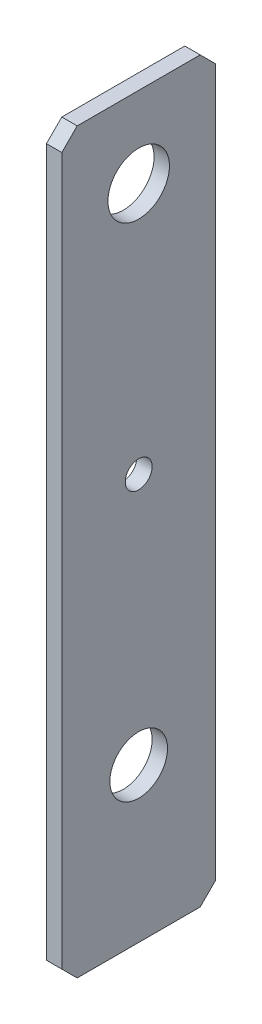
ISO-10303-21;
HEADER;
FILE_DESCRIPTION(('STEP AP214'),'2;1');
FILE_NAME('part.step','',(''),(''),'','','');
FILE_SCHEMA(('AUTOMOTIVE_DESIGN { 1 0 10303 214 1 1 1 1 }'));
ENDSEC;
DATA;
#1=APPLICATION_CONTEXT('core data for automotive mechanical design processes');
#2=APPLICATION_PROTOCOL_DEFINITION('international standard','automotive_design',2000,#1);
#3=PRODUCT_CONTEXT('',#1,'mechanical');
#4=PRODUCT('Part','Part','',(#3));
#5=PRODUCT_RELATED_PRODUCT_CATEGORY('part','',(#4));
#6=PRODUCT_DEFINITION_FORMATION('','',#4);
#7=PRODUCT_DEFINITION_CONTEXT('part definition',#1,'design');
#8=PRODUCT_DEFINITION('design','',#6,#7);
#9=PRODUCT_DEFINITION_SHAPE('','',#8);
#10=(LENGTH_UNIT() NAMED_UNIT(*) SI_UNIT(.MILLI.,.METRE.));
#11=(NAMED_UNIT(*) PLANE_ANGLE_UNIT() SI_UNIT($,.RADIAN.));
#12=(NAMED_UNIT(*) SI_UNIT($,.STERADIAN.) SOLID_ANGLE_UNIT());
#13=UNCERTAINTY_MEASURE_WITH_UNIT(LENGTH_MEASURE(1.E-05),#10,'distance_accuracy_value','');
#14=(GEOMETRIC_REPRESENTATION_CONTEXT(3) GLOBAL_UNCERTAINTY_ASSIGNED_CONTEXT((#13)) GLOBAL_UNIT_ASSIGNED_CONTEXT((#10,
#11,#12)) REPRESENTATION_CONTEXT('',''));
#15=CARTESIAN_POINT('',(0.,0.,0.));
#16=DIRECTION('',(0.,0.,1.));
#17=DIRECTION('',(1.,0.,0.));
#18=AXIS2_PLACEMENT_3D('',#15,#16,#17);
#19=CARTESIAN_POINT('',(2.,-48.,-10.));
#20=DIRECTION('',(0.,0.,1.));
#21=DIRECTION('',(1.,0.,0.));
#22=AXIS2_PLACEMENT_3D('',#19,#20,#21);
#23=PLANE('',#22);
#24=DIRECTION('',(0.,1.,0.));
#25=VECTOR('',#24,1.);
#26=CARTESIAN_POINT('',(2.,-48.,-10.));
#27=LINE('',#26,#25);
#28=CARTESIAN_POINT('',(2.,-46.,-10.));
#29=VERTEX_POINT('',#28);
#30=CARTESIAN_POINT('',(2.,46.,-10.));
#31=VERTEX_POINT('',#30);
#32=EDGE_CURVE('E134',#29,#31,#27,.T.);
#33=ORIENTED_EDGE('',*,*,#32,.F.);
#34=DIRECTION('',(-1.,0.,0.));
#35=VECTOR('',#34,1.);
#36=CARTESIAN_POINT('',(2.,-46.,-10.));
#37=LINE('',#36,#35);
#38=CARTESIAN_POINT('',(0.,-46.,-10.));
#39=VERTEX_POINT('',#38);
#40=EDGE_CURVE('E160',#29,#39,#37,.T.);
#41=ORIENTED_EDGE('',*,*,#40,.T.);
#42=DIRECTION('',(0.,1.,0.));
#43=VECTOR('',#42,1.);
#44=CARTESIAN_POINT('',(0.,-48.,-10.));
#45=LINE('',#44,#43);
#46=CARTESIAN_POINT('',(0.,46.,-10.));
#47=VERTEX_POINT('',#46);
#48=EDGE_CURVE('E166',#39,#47,#45,.T.);
#49=ORIENTED_EDGE('',*,*,#48,.T.);
#50=DIRECTION('',(1.,0.,0.));
#51=VECTOR('',#50,1.);
#52=CARTESIAN_POINT('',(2.,46.,-10.));
#53=LINE('',#52,#51);
#54=EDGE_CURVE('E158',#47,#31,#53,.T.);
#55=ORIENTED_EDGE('',*,*,#54,.T.);
#56=EDGE_LOOP('',(#33,#41,#49,#55));
#57=FACE_BOUND('',#56,.T.);
#58=ADVANCED_FACE('F41',(#57),#23,.F.);
#59=CARTESIAN_POINT('',(2.,48.,10.));
#60=DIRECTION('',(0.,-1.,0.));
#61=DIRECTION('',(0.,0.,-1.));
#62=AXIS2_PLACEMENT_3D('',#59,#60,#61);
#63=PLANE('',#62);
#64=DIRECTION('',(0.,0.,1.));
#65=VECTOR('',#64,1.);
#66=CARTESIAN_POINT('',(2.,48.,10.));
#67=LINE('',#66,#65);
#68=CARTESIAN_POINT('',(2.,48.,-8.));
#69=VERTEX_POINT('',#68);
#70=CARTESIAN_POINT('',(2.,48.,7.99999999999999));
#71=VERTEX_POINT('',#70);
#72=EDGE_CURVE('E137',#69,#71,#67,.T.);
#73=ORIENTED_EDGE('',*,*,#72,.F.);
#74=DIRECTION('',(-1.,0.,0.));
#75=VECTOR('',#74,1.);
#76=CARTESIAN_POINT('',(2.,48.,-8.));
#77=LINE('',#76,#75);
#78=CARTESIAN_POINT('',(0.,48.,-8.));
#79=VERTEX_POINT('',#78);
#80=EDGE_CURVE('E11',#69,#79,#77,.T.);
#81=ORIENTED_EDGE('',*,*,#80,.T.);
#82=DIRECTION('',(0.,0.,1.));
#83=VECTOR('',#82,1.);
#84=CARTESIAN_POINT('',(0.,48.,10.));
#85=LINE('',#84,#83);
#86=CARTESIAN_POINT('',(0.,48.,7.99999999999999));
#87=VERTEX_POINT('',#86);
#88=EDGE_CURVE('E139',#79,#87,#85,.T.);
#89=ORIENTED_EDGE('',*,*,#88,.T.);
#90=DIRECTION('',(1.,0.,0.));
#91=VECTOR('',#90,1.);
#92=CARTESIAN_POINT('',(2.,48.,7.99999999999999));
#93=LINE('',#92,#91);
#94=EDGE_CURVE('E50',#87,#71,#93,.T.);
#95=ORIENTED_EDGE('',*,*,#94,.T.);
#96=EDGE_LOOP('',(#73,#81,#89,#95));
#97=FACE_BOUND('',#96,.T.);
#98=ADVANCED_FACE('F211',(#97),#63,.F.);
#99=CARTESIAN_POINT('',(2.,-48.,10.));
#100=DIRECTION('',(0.,0.,-1.));
#101=DIRECTION('',(-1.,0.,0.));
#102=AXIS2_PLACEMENT_3D('',#99,#100,#101);
#103=PLANE('',#102);
#104=DIRECTION('',(0.,-1.,0.));
#105=VECTOR('',#104,1.);
#106=CARTESIAN_POINT('',(0.,-48.,10.));
#107=LINE('',#106,#105);
#108=CARTESIAN_POINT('',(0.,46.,10.));
#109=VERTEX_POINT('',#108);
#110=CARTESIAN_POINT('',(0.,-46.,10.));
#111=VERTEX_POINT('',#110);
#112=EDGE_CURVE('E135',#109,#111,#107,.T.);
#113=ORIENTED_EDGE('',*,*,#112,.T.);
#114=DIRECTION('',(1.,0.,0.));
#115=VECTOR('',#114,1.);
#116=CARTESIAN_POINT('',(2.,-46.,10.));
#117=LINE('',#116,#115);
#118=CARTESIAN_POINT('',(2.,-46.,10.));
#119=VERTEX_POINT('',#118);
#120=EDGE_CURVE('E113',#111,#119,#117,.T.);
#121=ORIENTED_EDGE('',*,*,#120,.T.);
#122=DIRECTION('',(0.,-1.,0.));
#123=VECTOR('',#122,1.);
#124=CARTESIAN_POINT('',(2.,-48.,10.));
#125=LINE('',#124,#123);
#126=CARTESIAN_POINT('',(2.,46.,10.));
#127=VERTEX_POINT('',#126);
#128=EDGE_CURVE('E178',#127,#119,#125,.T.);
#129=ORIENTED_EDGE('',*,*,#128,.F.);
#130=DIRECTION('',(-1.,0.,0.));
#131=VECTOR('',#130,1.);
#132=CARTESIAN_POINT('',(2.,46.,10.));
#133=LINE('',#132,#131);
#134=EDGE_CURVE('E118',#127,#109,#133,.T.);
#135=ORIENTED_EDGE('',*,*,#134,.T.);
#136=EDGE_LOOP('',(#113,#121,#129,#135));
#137=FACE_BOUND('',#136,.T.);
#138=ADVANCED_FACE('F209',(#137),#103,.F.);
#139=CARTESIAN_POINT('',(2.,-48.,10.));
#140=DIRECTION('',(0.,1.,0.));
#141=DIRECTION('',(0.,0.,1.));
#142=AXIS2_PLACEMENT_3D('',#139,#140,#141);
#143=PLANE('',#142);
#144=DIRECTION('',(0.,0.,-1.));
#145=VECTOR('',#144,1.);
#146=CARTESIAN_POINT('',(2.,-48.,10.));
#147=LINE('',#146,#145);
#148=CARTESIAN_POINT('',(2.,-48.,8.));
#149=VERTEX_POINT('',#148);
#150=CARTESIAN_POINT('',(2.,-48.,-7.99999999999998));
#151=VERTEX_POINT('',#150);
#152=EDGE_CURVE('E128',#149,#151,#147,.T.);
#153=ORIENTED_EDGE('',*,*,#152,.F.);
#154=DIRECTION('',(-1.,0.,0.));
#155=VECTOR('',#154,1.);
#156=CARTESIAN_POINT('',(2.,-48.,8.));
#157=LINE('',#156,#155);
#158=CARTESIAN_POINT('',(0.,-48.,8.));
#159=VERTEX_POINT('',#158);
#160=EDGE_CURVE('E112',#149,#159,#157,.T.);
#161=ORIENTED_EDGE('',*,*,#160,.T.);
#162=DIRECTION('',(0.,0.,-1.));
#163=VECTOR('',#162,1.);
#164=CARTESIAN_POINT('',(0.,-48.,10.));
#165=LINE('',#164,#163);
#166=CARTESIAN_POINT('',(0.,-48.,-7.99999999999998));
#167=VERTEX_POINT('',#166);
#168=EDGE_CURVE('E125',#159,#167,#165,.T.);
#169=ORIENTED_EDGE('',*,*,#168,.T.);
#170=DIRECTION('',(1.,0.,0.));
#171=VECTOR('',#170,1.);
#172=CARTESIAN_POINT('',(2.,-48.,-7.99999999999998));
#173=LINE('',#172,#171);
#174=EDGE_CURVE('E130',#167,#151,#173,.T.);
#175=ORIENTED_EDGE('',*,*,#174,.T.);
#176=EDGE_LOOP('',(#153,#161,#169,#175));
#177=FACE_BOUND('',#176,.T.);
#178=ADVANCED_FACE('F124',(#177),#143,.F.);
#179=CARTESIAN_POINT('',(2.,0.,0.));
#180=DIRECTION('',(-1.,0.,0.));
#181=DIRECTION('',(0.,0.,1.));
#182=AXIS2_PLACEMENT_3D('',#179,#180,#181);
#183=PLANE('',#182);
#184=CARTESIAN_POINT('',(2.,-28.,0.));
#185=DIRECTION('',(1.,0.,0.));
#186=DIRECTION('',(0.,0.,-1.));
#187=AXIS2_PLACEMENT_3D('',#184,#185,#186);
#188=CIRCLE('',#187,3.75);
#189=CARTESIAN_POINT('',(2.,-28.,-3.75));
#190=VERTEX_POINT('',#189);
#191=EDGE_CURVE('E188',#190,#190,#188,.T.);
#192=ORIENTED_EDGE('',*,*,#191,.F.);
#193=EDGE_LOOP('',(#192));
#194=FACE_BOUND('',#193,.T.);
#195=CARTESIAN_POINT('',(2.,37.5,0.));
#196=DIRECTION('',(1.,0.,0.));
#197=DIRECTION('',(0.,0.,-1.));
#198=AXIS2_PLACEMENT_3D('',#195,#196,#197);
#199=CIRCLE('',#198,4.);
#200=CARTESIAN_POINT('',(2.,37.5,-4.));
#201=VERTEX_POINT('',#200);
#202=EDGE_CURVE('E183',#201,#201,#199,.T.);
#203=ORIENTED_EDGE('',*,*,#202,.F.);
#204=EDGE_LOOP('',(#203));
#205=FACE_BOUND('',#204,.T.);
#206=CARTESIAN_POINT('',(2.,4.74999999999999,0.));
#207=DIRECTION('',(1.,0.,0.));
#208=DIRECTION('',(0.,0.,-1.));
#209=AXIS2_PLACEMENT_3D('',#206,#207,#208);
#210=CIRCLE('',#209,1.75);
#211=CARTESIAN_POINT('',(2.,4.74999999999999,-1.75));
#212=VERTEX_POINT('',#211);
#213=EDGE_CURVE('E174',#212,#212,#210,.T.);
#214=ORIENTED_EDGE('',*,*,#213,.F.);
#215=EDGE_LOOP('',(#214));
#216=FACE_BOUND('',#215,.T.);
#217=ORIENTED_EDGE('',*,*,#128,.T.);
#218=DIRECTION('',(0.,0.70710678118655,0.707106781186545));
#219=VECTOR('',#218,1.);
#220=CARTESIAN_POINT('',(2.,-48.,8.));
#221=LINE('',#220,#219);
#222=EDGE_CURVE('E156',#119,#149,#221,.F.);
#223=ORIENTED_EDGE('',*,*,#222,.T.);
#224=ORIENTED_EDGE('',*,*,#152,.T.);
#225=DIRECTION('',(0.,-0.707106781186545,0.70710678118655));
#226=VECTOR('',#225,1.);
#227=CARTESIAN_POINT('',(2.,-46.,-10.));
#228=LINE('',#227,#226);
#229=EDGE_CURVE('E154',#151,#29,#228,.F.);
#230=ORIENTED_EDGE('',*,*,#229,.T.);
#231=ORIENTED_EDGE('',*,*,#32,.T.);
#232=DIRECTION('',(0.,-0.70710678118655,-0.707106781186545));
#233=VECTOR('',#232,1.);
#234=CARTESIAN_POINT('',(2.,48.,-8.));
#235=LINE('',#234,#233);
#236=EDGE_CURVE('E63',#31,#69,#235,.F.);
#237=ORIENTED_EDGE('',*,*,#236,.T.);
#238=ORIENTED_EDGE('',*,*,#72,.T.);
#239=DIRECTION('',(0.,0.707106781186545,-0.70710678118655));
#240=VECTOR('',#239,1.);
#241=CARTESIAN_POINT('',(2.,46.,10.));
#242=LINE('',#241,#240);
#243=EDGE_CURVE('E151',#71,#127,#242,.F.);
#244=ORIENTED_EDGE('',*,*,#243,.T.);
#245=EDGE_LOOP('',(#217,#223,#224,#230,#231,#237,#238,#244));
#246=FACE_BOUND('',#245,.T.);
#247=ADVANCED_FACE('F199',(#194,#205,#216,#246),#183,.F.);
#248=CARTESIAN_POINT('',(0.,0.,0.));
#249=DIRECTION('',(-1.,0.,0.));
#250=DIRECTION('',(0.,0.,1.));
#251=AXIS2_PLACEMENT_3D('',#248,#249,#250);
#252=PLANE('',#251);
#253=CARTESIAN_POINT('',(0.,-28.,0.));
#254=DIRECTION('',(1.,0.,0.));
#255=DIRECTION('',(0.,0.,-1.));
#256=AXIS2_PLACEMENT_3D('',#253,#254,#255);
#257=CIRCLE('',#256,3.75);
#258=CARTESIAN_POINT('',(0.,-28.,-3.75));
#259=VERTEX_POINT('',#258);
#260=EDGE_CURVE('E185',#259,#259,#257,.T.);
#261=ORIENTED_EDGE('',*,*,#260,.T.);
#262=EDGE_LOOP('',(#261));
#263=FACE_BOUND('',#262,.T.);
#264=CARTESIAN_POINT('',(0.,37.5,0.));
#265=DIRECTION('',(1.,0.,0.));
#266=DIRECTION('',(0.,0.,-1.));
#267=AXIS2_PLACEMENT_3D('',#264,#265,#266);
#268=CIRCLE('',#267,4.);
#269=CARTESIAN_POINT('',(0.,37.5,-4.));
#270=VERTEX_POINT('',#269);
#271=EDGE_CURVE('E191',#270,#270,#268,.T.);
#272=ORIENTED_EDGE('',*,*,#271,.T.);
#273=EDGE_LOOP('',(#272));
#274=FACE_BOUND('',#273,.T.);
#275=CARTESIAN_POINT('',(0.,4.74999999999999,0.));
#276=DIRECTION('',(1.,0.,0.));
#277=DIRECTION('',(0.,0.,-1.));
#278=AXIS2_PLACEMENT_3D('',#275,#276,#277);
#279=CIRCLE('',#278,1.75);
#280=CARTESIAN_POINT('',(0.,4.74999999999999,-1.75));
#281=VERTEX_POINT('',#280);
#282=EDGE_CURVE('E171',#281,#281,#279,.T.);
#283=ORIENTED_EDGE('',*,*,#282,.T.);
#284=EDGE_LOOP('',(#283));
#285=FACE_BOUND('',#284,.T.);
#286=ORIENTED_EDGE('',*,*,#168,.F.);
#287=DIRECTION('',(0.,-0.70710678118655,-0.707106781186545));
#288=VECTOR('',#287,1.);
#289=CARTESIAN_POINT('',(0.,-27.9999999999998,28.));
#290=LINE('',#289,#288);
#291=EDGE_CURVE('E108',#159,#111,#290,.F.);
#292=ORIENTED_EDGE('',*,*,#291,.T.);
#293=ORIENTED_EDGE('',*,*,#112,.F.);
#294=DIRECTION('',(0.,-0.707106781186545,0.70710678118655));
#295=VECTOR('',#294,1.);
#296=CARTESIAN_POINT('',(0.,28.0000000000002,28.));
#297=LINE('',#296,#295);
#298=EDGE_CURVE('E129',#109,#87,#297,.F.);
#299=ORIENTED_EDGE('',*,*,#298,.T.);
#300=ORIENTED_EDGE('',*,*,#88,.F.);
#301=DIRECTION('',(0.,0.70710678118655,0.707106781186545));
#302=VECTOR('',#301,1.);
#303=CARTESIAN_POINT('',(0.,27.9999999999998,-28.));
#304=LINE('',#303,#302);
#305=EDGE_CURVE('E145',#79,#47,#304,.F.);
#306=ORIENTED_EDGE('',*,*,#305,.T.);
#307=ORIENTED_EDGE('',*,*,#48,.F.);
#308=DIRECTION('',(0.,0.707106781186545,-0.70710678118655));
#309=VECTOR('',#308,1.);
#310=CARTESIAN_POINT('',(0.,-28.0000000000002,-28.));
#311=LINE('',#310,#309);
#312=EDGE_CURVE('E119',#39,#167,#311,.F.);
#313=ORIENTED_EDGE('',*,*,#312,.T.);
#314=EDGE_LOOP('',(#286,#292,#293,#299,#300,#306,#307,#313));
#315=FACE_BOUND('',#314,.T.);
#316=ADVANCED_FACE('F132',(#263,#274,#285,#315),#252,.T.);
#317=CARTESIAN_POINT('',(0.,4.74999999999999,0.));
#318=DIRECTION('',(1.,0.,0.));
#319=DIRECTION('',(0.,0.,-1.));
#320=AXIS2_PLACEMENT_3D('',#317,#318,#319);
#321=CYLINDRICAL_SURFACE('',#320,1.75);
#322=ORIENTED_EDGE('',*,*,#282,.F.);
#323=EDGE_LOOP('',(#322));
#324=FACE_BOUND('',#323,.T.);
#325=ORIENTED_EDGE('',*,*,#213,.T.);
#326=EDGE_LOOP('',(#325));
#327=FACE_BOUND('',#326,.T.);
#328=ADVANCED_FACE('F248',(#324,#327),#321,.F.);
#329=CARTESIAN_POINT('',(0.,37.5,0.));
#330=DIRECTION('',(1.,0.,0.));
#331=DIRECTION('',(0.,0.,-1.));
#332=AXIS2_PLACEMENT_3D('',#329,#330,#331);
#333=CYLINDRICAL_SURFACE('',#332,4.);
#334=ORIENTED_EDGE('',*,*,#271,.F.);
#335=EDGE_LOOP('',(#334));
#336=FACE_BOUND('',#335,.T.);
#337=ORIENTED_EDGE('',*,*,#202,.T.);
#338=EDGE_LOOP('',(#337));
#339=FACE_BOUND('',#338,.T.);
#340=ADVANCED_FACE('F197',(#336,#339),#333,.F.);
#341=CARTESIAN_POINT('',(0.,-28.,0.));
#342=DIRECTION('',(1.,0.,0.));
#343=DIRECTION('',(0.,0.,-1.));
#344=AXIS2_PLACEMENT_3D('',#341,#342,#343);
#345=CYLINDRICAL_SURFACE('',#344,3.75);
#346=ORIENTED_EDGE('',*,*,#260,.F.);
#347=EDGE_LOOP('',(#346));
#348=FACE_BOUND('',#347,.T.);
#349=ORIENTED_EDGE('',*,*,#191,.T.);
#350=EDGE_LOOP('',(#349));
#351=FACE_BOUND('',#350,.T.);
#352=ADVANCED_FACE('F222',(#348,#351),#345,.F.);
#353=CARTESIAN_POINT('',(2.,-48.,8.));
#354=DIRECTION('',(0.,0.707106781186545,-0.70710678118655));
#355=DIRECTION('',(-1.,0.,0.));
#356=AXIS2_PLACEMENT_3D('',#353,#354,#355);
#357=PLANE('',#356);
#358=ORIENTED_EDGE('',*,*,#222,.F.);
#359=ORIENTED_EDGE('',*,*,#120,.F.);
#360=ORIENTED_EDGE('',*,*,#291,.F.);
#361=ORIENTED_EDGE('',*,*,#160,.F.);
#362=EDGE_LOOP('',(#358,#359,#360,#361));
#363=FACE_BOUND('',#362,.T.);
#364=ADVANCED_FACE('F111',(#363),#357,.F.);
#365=CARTESIAN_POINT('',(2.,-46.,-10.));
#366=DIRECTION('',(0.,0.70710678118655,0.707106781186545));
#367=DIRECTION('',(-1.,0.,0.));
#368=AXIS2_PLACEMENT_3D('',#365,#366,#367);
#369=PLANE('',#368);
#370=ORIENTED_EDGE('',*,*,#229,.F.);
#371=ORIENTED_EDGE('',*,*,#174,.F.);
#372=ORIENTED_EDGE('',*,*,#312,.F.);
#373=ORIENTED_EDGE('',*,*,#40,.F.);
#374=EDGE_LOOP('',(#370,#371,#372,#373));
#375=FACE_BOUND('',#374,.T.);
#376=ADVANCED_FACE('F215',(#375),#369,.F.);
#377=CARTESIAN_POINT('',(2.,48.,-8.));
#378=DIRECTION('',(0.,-0.707106781186545,0.70710678118655));
#379=DIRECTION('',(-1.,0.,0.));
#380=AXIS2_PLACEMENT_3D('',#377,#378,#379);
#381=PLANE('',#380);
#382=ORIENTED_EDGE('',*,*,#236,.F.);
#383=ORIENTED_EDGE('',*,*,#54,.F.);
#384=ORIENTED_EDGE('',*,*,#305,.F.);
#385=ORIENTED_EDGE('',*,*,#80,.F.);
#386=EDGE_LOOP('',(#382,#383,#384,#385));
#387=FACE_BOUND('',#386,.T.);
#388=ADVANCED_FACE('F214',(#387),#381,.F.);
#389=CARTESIAN_POINT('',(2.,46.,10.));
#390=DIRECTION('',(0.,-0.70710678118655,-0.707106781186545));
#391=DIRECTION('',(-1.,0.,0.));
#392=AXIS2_PLACEMENT_3D('',#389,#390,#391);
#393=PLANE('',#392);
#394=ORIENTED_EDGE('',*,*,#243,.F.);
#395=ORIENTED_EDGE('',*,*,#94,.F.);
#396=ORIENTED_EDGE('',*,*,#298,.F.);
#397=ORIENTED_EDGE('',*,*,#134,.F.);
#398=EDGE_LOOP('',(#394,#395,#396,#397));
#399=FACE_BOUND('',#398,.T.);
#400=ADVANCED_FACE('F44',(#399),#393,.F.);
#401=CLOSED_SHELL('',(#58,#98,#138,#178,#247,#316,#328,#340,#352,#364,#376,#388,#400));
#402=MANIFOLD_SOLID_BREP('B2',#401);
#403=ADVANCED_BREP_SHAPE_REPRESENTATION('',(#18,#402),#14);
#404=SHAPE_DEFINITION_REPRESENTATION(#9,#403);
ENDSEC;
END-ISO-10303-21;
